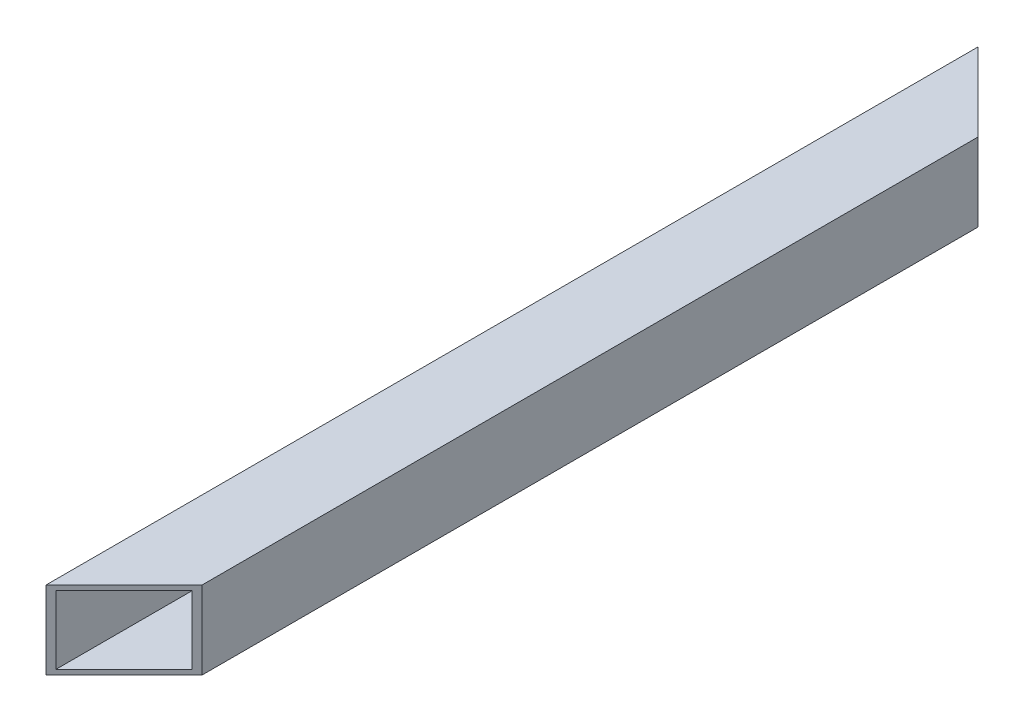
ISO-10303-21;
HEADER;
FILE_DESCRIPTION(('STEP AP214'),'2;1');
FILE_NAME('part.step','',(''),(''),'','','');
FILE_SCHEMA(('AUTOMOTIVE_DESIGN { 1 0 10303 214 1 1 1 1 }'));
ENDSEC;
DATA;
#1=APPLICATION_CONTEXT('core data for automotive mechanical design processes');
#2=APPLICATION_PROTOCOL_DEFINITION('international standard','automotive_design',2000,#1);
#3=PRODUCT_CONTEXT('',#1,'mechanical');
#4=PRODUCT('Part','Part','',(#3));
#5=PRODUCT_RELATED_PRODUCT_CATEGORY('part','',(#4));
#6=PRODUCT_DEFINITION_FORMATION('','',#4);
#7=PRODUCT_DEFINITION_CONTEXT('part definition',#1,'design');
#8=PRODUCT_DEFINITION('design','',#6,#7);
#9=PRODUCT_DEFINITION_SHAPE('','',#8);
#10=(LENGTH_UNIT() NAMED_UNIT(*) SI_UNIT(.MILLI.,.METRE.));
#11=(NAMED_UNIT(*) PLANE_ANGLE_UNIT() SI_UNIT($,.RADIAN.));
#12=(NAMED_UNIT(*) SI_UNIT($,.STERADIAN.) SOLID_ANGLE_UNIT());
#13=UNCERTAINTY_MEASURE_WITH_UNIT(LENGTH_MEASURE(1.E-05),#10,'distance_accuracy_value','');
#14=(GEOMETRIC_REPRESENTATION_CONTEXT(3) GLOBAL_UNCERTAINTY_ASSIGNED_CONTEXT((#13)) GLOBAL_UNIT_ASSIGNED_CONTEXT((#10,
#11,#12)) REPRESENTATION_CONTEXT('',''));
#15=CARTESIAN_POINT('',(0.,0.,0.));
#16=DIRECTION('',(0.,0.,1.));
#17=DIRECTION('',(1.,0.,0.));
#18=AXIS2_PLACEMENT_3D('',#15,#16,#17);
#19=CARTESIAN_POINT('',(8.3,-8.3,113.49));
#20=DIRECTION('',(0.,1.,0.));
#21=DIRECTION('',(-1.,0.,0.));
#22=AXIS2_PLACEMENT_3D('',#19,#20,#21);
#23=PLANE('',#22);
#24=DIRECTION('',(-0.707106781186547,0.,0.707106781186548));
#25=VECTOR('',#24,1.);
#26=CARTESIAN_POINT('',(-0.6,-8.3,104.59));
#27=LINE('',#26,#25);
#28=CARTESIAN_POINT('',(8.3,-8.3,95.69));
#29=VERTEX_POINT('',#28);
#30=CARTESIAN_POINT('',(-8.3,-8.3,112.29));
#31=VERTEX_POINT('',#30);
#32=EDGE_CURVE('E11',#29,#31,#27,.T.);
#33=ORIENTED_EDGE('',*,*,#32,.F.);
#34=DIRECTION('',(0.,0.,-1.));
#35=VECTOR('',#34,1.);
#36=CARTESIAN_POINT('',(8.3,-8.3,113.49));
#37=LINE('',#36,#35);
#38=CARTESIAN_POINT('',(8.3,-8.3,-95.69));
#39=VERTEX_POINT('',#38);
#40=EDGE_CURVE('E138',#29,#39,#37,.T.);
#41=ORIENTED_EDGE('',*,*,#40,.T.);
#42=DIRECTION('',(0.707106781186547,0.,0.707106781186548));
#43=VECTOR('',#42,1.);
#44=CARTESIAN_POINT('',(112.89,-8.29999999999997,8.90000000000001));
#45=LINE('',#44,#43);
#46=CARTESIAN_POINT('',(-8.3,-8.3,-112.29));
#47=VERTEX_POINT('',#46);
#48=EDGE_CURVE('E45',#47,#39,#45,.T.);
#49=ORIENTED_EDGE('',*,*,#48,.F.);
#50=DIRECTION('',(0.,0.,-1.));
#51=VECTOR('',#50,1.);
#52=CARTESIAN_POINT('',(-8.3,-8.3,113.49));
#53=LINE('',#52,#51);
#54=EDGE_CURVE('E135',#31,#47,#53,.T.);
#55=ORIENTED_EDGE('',*,*,#54,.F.);
#56=EDGE_LOOP('',(#33,#41,#49,#55));
#57=FACE_BOUND('',#56,.T.);
#58=ADVANCED_FACE('F37',(#57),#23,.T.);
#59=CARTESIAN_POINT('',(-8.3,8.3,113.49));
#60=DIRECTION('',(1.,0.,0.));
#61=DIRECTION('',(0.,1.,0.));
#62=AXIS2_PLACEMENT_3D('',#59,#60,#61);
#63=PLANE('',#62);
#64=DIRECTION('',(0.,1.,0.));
#65=VECTOR('',#64,1.);
#66=CARTESIAN_POINT('',(-8.3,8.3,112.29));
#67=LINE('',#66,#65);
#68=CARTESIAN_POINT('',(-8.3,8.3,112.29));
#69=VERTEX_POINT('',#68);
#70=EDGE_CURVE('E144',#31,#69,#67,.T.);
#71=ORIENTED_EDGE('',*,*,#70,.F.);
#72=ORIENTED_EDGE('',*,*,#54,.T.);
#73=DIRECTION('',(0.,-1.,0.));
#74=VECTOR('',#73,1.);
#75=CARTESIAN_POINT('',(-8.3,8.29999999999999,-112.29));
#76=LINE('',#75,#74);
#77=CARTESIAN_POINT('',(-8.3,8.3,-112.29));
#78=VERTEX_POINT('',#77);
#79=EDGE_CURVE('E150',#78,#47,#76,.T.);
#80=ORIENTED_EDGE('',*,*,#79,.F.);
#81=DIRECTION('',(0.,0.,-1.));
#82=VECTOR('',#81,1.);
#83=CARTESIAN_POINT('',(-8.3,8.3,113.49));
#84=LINE('',#83,#82);
#85=EDGE_CURVE('E132',#69,#78,#84,.T.);
#86=ORIENTED_EDGE('',*,*,#85,.F.);
#87=EDGE_LOOP('',(#71,#72,#80,#86));
#88=FACE_BOUND('',#87,.T.);
#89=ADVANCED_FACE('F182',(#88),#63,.T.);
#90=CARTESIAN_POINT('',(8.3,8.30000000000001,113.49));
#91=DIRECTION('',(0.,-1.,0.));
#92=DIRECTION('',(1.,0.,0.));
#93=AXIS2_PLACEMENT_3D('',#90,#91,#92);
#94=PLANE('',#93);
#95=DIRECTION('',(0.707106781186547,0.,-0.707106781186548));
#96=VECTOR('',#95,1.);
#97=CARTESIAN_POINT('',(-0.600000000000002,8.3,104.59));
#98=LINE('',#97,#96);
#99=CARTESIAN_POINT('',(8.3,8.30000000000001,95.69));
#100=VERTEX_POINT('',#99);
#101=EDGE_CURVE('E142',#69,#100,#98,.T.);
#102=ORIENTED_EDGE('',*,*,#101,.F.);
#103=ORIENTED_EDGE('',*,*,#85,.T.);
#104=DIRECTION('',(-0.707106781186547,0.,-0.707106781186548));
#105=VECTOR('',#104,1.);
#106=CARTESIAN_POINT('',(112.89,8.30000000000003,8.90000000000001));
#107=LINE('',#106,#105);
#108=CARTESIAN_POINT('',(8.3,8.30000000000001,-95.69));
#109=VERTEX_POINT('',#108);
#110=EDGE_CURVE('E148',#109,#78,#107,.T.);
#111=ORIENTED_EDGE('',*,*,#110,.F.);
#112=DIRECTION('',(0.,0.,-1.));
#113=VECTOR('',#112,1.);
#114=CARTESIAN_POINT('',(8.3,8.30000000000001,113.49));
#115=LINE('',#114,#113);
#116=EDGE_CURVE('E128',#100,#109,#115,.T.);
#117=ORIENTED_EDGE('',*,*,#116,.F.);
#118=EDGE_LOOP('',(#102,#103,#111,#117));
#119=FACE_BOUND('',#118,.T.);
#120=ADVANCED_FACE('F177',(#119),#94,.T.);
#121=CARTESIAN_POINT('',(8.3,8.30000000000001,113.49));
#122=DIRECTION('',(-1.,0.,0.));
#123=DIRECTION('',(0.,-1.,0.));
#124=AXIS2_PLACEMENT_3D('',#121,#122,#123);
#125=PLANE('',#124);
#126=DIRECTION('',(0.,-1.,0.));
#127=VECTOR('',#126,1.);
#128=CARTESIAN_POINT('',(8.3,8.30000000000001,95.69));
#129=LINE('',#128,#127);
#130=EDGE_CURVE('E59',#100,#29,#129,.T.);
#131=ORIENTED_EDGE('',*,*,#130,.F.);
#132=ORIENTED_EDGE('',*,*,#116,.T.);
#133=DIRECTION('',(0.,1.,0.));
#134=VECTOR('',#133,1.);
#135=CARTESIAN_POINT('',(8.3,8.30000000000001,-95.69));
#136=LINE('',#135,#134);
#137=EDGE_CURVE('E146',#39,#109,#136,.T.);
#138=ORIENTED_EDGE('',*,*,#137,.F.);
#139=ORIENTED_EDGE('',*,*,#40,.F.);
#140=EDGE_LOOP('',(#131,#132,#138,#139));
#141=FACE_BOUND('',#140,.T.);
#142=ADVANCED_FACE('F169',(#141),#125,.T.);
#143=CARTESIAN_POINT('',(9.5,-9.5,-94.49));
#144=DIRECTION('',(-0.707106781186548,0.,0.707106781186547));
#145=DIRECTION('',(0.707106781186547,0.,0.707106781186548));
#146=AXIS2_PLACEMENT_3D('',#143,#144,#145);
#147=PLANE('',#146);
#148=ORIENTED_EDGE('',*,*,#137,.T.);
#149=ORIENTED_EDGE('',*,*,#110,.T.);
#150=ORIENTED_EDGE('',*,*,#79,.T.);
#151=ORIENTED_EDGE('',*,*,#48,.T.);
#152=EDGE_LOOP('',(#148,#149,#150,#151));
#153=FACE_BOUND('',#152,.T.);
#154=DIRECTION('',(0.707106781186548,0.,0.707106781186548));
#155=VECTOR('',#154,1.);
#156=CARTESIAN_POINT('',(9.5,9.5,-94.49));
#157=LINE('',#156,#155);
#158=CARTESIAN_POINT('',(-9.5,9.5,-113.49));
#159=VERTEX_POINT('',#158);
#160=CARTESIAN_POINT('',(9.5,9.5,-94.49));
#161=VERTEX_POINT('',#160);
#162=EDGE_CURVE('E154',#159,#161,#157,.T.);
#163=ORIENTED_EDGE('',*,*,#162,.T.);
#164=DIRECTION('',(0.,1.,0.));
#165=VECTOR('',#164,1.);
#166=CARTESIAN_POINT('',(9.5,-9.5,-94.49));
#167=LINE('',#166,#165);
#168=CARTESIAN_POINT('',(9.5,-9.5,-94.49));
#169=VERTEX_POINT('',#168);
#170=EDGE_CURVE('E155',#169,#161,#167,.T.);
#171=ORIENTED_EDGE('',*,*,#170,.F.);
#172=DIRECTION('',(0.707106781186548,0.,0.707106781186548));
#173=VECTOR('',#172,1.);
#174=CARTESIAN_POINT('',(9.5,-9.5,-94.49));
#175=LINE('',#174,#173);
#176=CARTESIAN_POINT('',(-9.5,-9.5,-113.49));
#177=VERTEX_POINT('',#176);
#178=EDGE_CURVE('E152',#177,#169,#175,.T.);
#179=ORIENTED_EDGE('',*,*,#178,.F.);
#180=DIRECTION('',(0.,-1.,0.));
#181=VECTOR('',#180,1.);
#182=CARTESIAN_POINT('',(-9.5,9.5,-113.49));
#183=LINE('',#182,#181);
#184=EDGE_CURVE('E109',#159,#177,#183,.T.);
#185=ORIENTED_EDGE('',*,*,#184,.F.);
#186=EDGE_LOOP('',(#163,#171,#179,#185));
#187=FACE_BOUND('',#186,.T.);
#188=ADVANCED_FACE('F167',(#153,#187),#147,.F.);
#189=CARTESIAN_POINT('',(9.5,-9.5,94.49));
#190=DIRECTION('',(-0.707106781186548,0.,-0.707106781186547));
#191=DIRECTION('',(-0.707106781186547,0.,0.707106781186548));
#192=AXIS2_PLACEMENT_3D('',#189,#190,#191);
#193=PLANE('',#192);
#194=ORIENTED_EDGE('',*,*,#130,.T.);
#195=ORIENTED_EDGE('',*,*,#32,.T.);
#196=ORIENTED_EDGE('',*,*,#70,.T.);
#197=ORIENTED_EDGE('',*,*,#101,.T.);
#198=EDGE_LOOP('',(#194,#195,#196,#197));
#199=FACE_BOUND('',#198,.T.);
#200=DIRECTION('',(-0.707106781186548,0.,0.707106781186548));
#201=VECTOR('',#200,1.);
#202=CARTESIAN_POINT('',(9.5,9.5,94.49));
#203=LINE('',#202,#201);
#204=CARTESIAN_POINT('',(9.5,9.5,94.49));
#205=VERTEX_POINT('',#204);
#206=CARTESIAN_POINT('',(-9.5,9.5,113.49));
#207=VERTEX_POINT('',#206);
#208=EDGE_CURVE('E103',#205,#207,#203,.T.);
#209=ORIENTED_EDGE('',*,*,#208,.T.);
#210=DIRECTION('',(0.,-1.,0.));
#211=VECTOR('',#210,1.);
#212=CARTESIAN_POINT('',(-9.5,9.5,113.49));
#213=LINE('',#212,#211);
#214=CARTESIAN_POINT('',(-9.5,-9.5,113.49));
#215=VERTEX_POINT('',#214);
#216=EDGE_CURVE('E99',#207,#215,#213,.T.);
#217=ORIENTED_EDGE('',*,*,#216,.T.);
#218=DIRECTION('',(-0.707106781186548,0.,0.707106781186548));
#219=VECTOR('',#218,1.);
#220=CARTESIAN_POINT('',(9.5,-9.5,94.49));
#221=LINE('',#220,#219);
#222=CARTESIAN_POINT('',(9.5,-9.5,94.49));
#223=VERTEX_POINT('',#222);
#224=EDGE_CURVE('E102',#223,#215,#221,.T.);
#225=ORIENTED_EDGE('',*,*,#224,.F.);
#226=DIRECTION('',(0.,1.,0.));
#227=VECTOR('',#226,1.);
#228=CARTESIAN_POINT('',(9.5,-9.5,94.49));
#229=LINE('',#228,#227);
#230=EDGE_CURVE('E52',#223,#205,#229,.T.);
#231=ORIENTED_EDGE('',*,*,#230,.T.);
#232=EDGE_LOOP('',(#209,#217,#225,#231));
#233=FACE_BOUND('',#232,.T.);
#234=ADVANCED_FACE('F101',(#199,#233),#193,.F.);
#235=CARTESIAN_POINT('',(-9.5,9.5,113.49));
#236=DIRECTION('',(1.,0.,0.));
#237=DIRECTION('',(0.,1.,0.));
#238=AXIS2_PLACEMENT_3D('',#235,#236,#237);
#239=PLANE('',#238);
#240=ORIENTED_EDGE('',*,*,#184,.T.);
#241=DIRECTION('',(0.,0.,-1.));
#242=VECTOR('',#241,1.);
#243=CARTESIAN_POINT('',(-9.5,-9.5,113.49));
#244=LINE('',#243,#242);
#245=EDGE_CURVE('E116',#215,#177,#244,.T.);
#246=ORIENTED_EDGE('',*,*,#245,.F.);
#247=ORIENTED_EDGE('',*,*,#216,.F.);
#248=DIRECTION('',(0.,0.,-1.));
#249=VECTOR('',#248,1.);
#250=CARTESIAN_POINT('',(-9.5,9.5,113.49));
#251=LINE('',#250,#249);
#252=EDGE_CURVE('E108',#207,#159,#251,.T.);
#253=ORIENTED_EDGE('',*,*,#252,.T.);
#254=EDGE_LOOP('',(#240,#246,#247,#253));
#255=FACE_BOUND('',#254,.T.);
#256=ADVANCED_FACE('F39',(#255),#239,.F.);
#257=CARTESIAN_POINT('',(9.5,-9.49999999999999,113.49));
#258=DIRECTION('',(0.,1.,0.));
#259=DIRECTION('',(-1.,0.,0.));
#260=AXIS2_PLACEMENT_3D('',#257,#258,#259);
#261=PLANE('',#260);
#262=DIRECTION('',(0.,0.,-1.));
#263=VECTOR('',#262,1.);
#264=CARTESIAN_POINT('',(9.5,-9.49999999999999,113.49));
#265=LINE('',#264,#263);
#266=EDGE_CURVE('E119',#223,#169,#265,.T.);
#267=ORIENTED_EDGE('',*,*,#266,.F.);
#268=ORIENTED_EDGE('',*,*,#224,.T.);
#269=ORIENTED_EDGE('',*,*,#245,.T.);
#270=ORIENTED_EDGE('',*,*,#178,.T.);
#271=EDGE_LOOP('',(#267,#268,#269,#270));
#272=FACE_BOUND('',#271,.T.);
#273=ADVANCED_FACE('F114',(#272),#261,.F.);
#274=CARTESIAN_POINT('',(9.5,9.5,113.49));
#275=DIRECTION('',(-1.,0.,0.));
#276=DIRECTION('',(0.,-1.,0.));
#277=AXIS2_PLACEMENT_3D('',#274,#275,#276);
#278=PLANE('',#277);
#279=DIRECTION('',(0.,0.,-1.));
#280=VECTOR('',#279,1.);
#281=CARTESIAN_POINT('',(9.5,9.5,113.49));
#282=LINE('',#281,#280);
#283=EDGE_CURVE('E122',#205,#161,#282,.T.);
#284=ORIENTED_EDGE('',*,*,#283,.F.);
#285=ORIENTED_EDGE('',*,*,#230,.F.);
#286=ORIENTED_EDGE('',*,*,#266,.T.);
#287=ORIENTED_EDGE('',*,*,#170,.T.);
#288=EDGE_LOOP('',(#284,#285,#286,#287));
#289=FACE_BOUND('',#288,.T.);
#290=ADVANCED_FACE('F162',(#289),#278,.F.);
#291=CARTESIAN_POINT('',(9.5,9.5,113.49));
#292=DIRECTION('',(0.,-1.,0.));
#293=DIRECTION('',(1.,0.,0.));
#294=AXIS2_PLACEMENT_3D('',#291,#292,#293);
#295=PLANE('',#294);
#296=ORIENTED_EDGE('',*,*,#252,.F.);
#297=ORIENTED_EDGE('',*,*,#208,.F.);
#298=ORIENTED_EDGE('',*,*,#283,.T.);
#299=ORIENTED_EDGE('',*,*,#162,.F.);
#300=EDGE_LOOP('',(#296,#297,#298,#299));
#301=FACE_BOUND('',#300,.T.);
#302=ADVANCED_FACE('F166',(#301),#295,.F.);
#303=CLOSED_SHELL('',(#58,#89,#120,#142,#188,#234,#256,#273,#290,#302));
#304=MANIFOLD_SOLID_BREP('B2',#303);
#305=ADVANCED_BREP_SHAPE_REPRESENTATION('',(#18,#304),#14);
#306=SHAPE_DEFINITION_REPRESENTATION(#9,#305);
ENDSEC;
END-ISO-10303-21;
